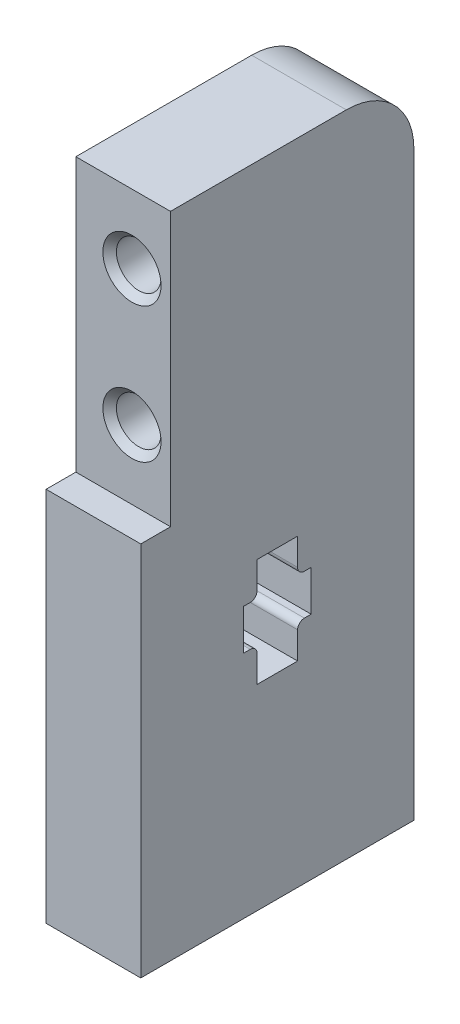
ISO-10303-21;
HEADER;
FILE_DESCRIPTION(('STEP AP214'),'2;1');
FILE_NAME('part.step','',(''),(''),'','','');
FILE_SCHEMA(('AUTOMOTIVE_DESIGN { 1 0 10303 214 1 1 1 1 }'));
ENDSEC;
DATA;
#1=APPLICATION_CONTEXT('core data for automotive mechanical design processes');
#2=APPLICATION_PROTOCOL_DEFINITION('international standard','automotive_design',2000,#1);
#3=PRODUCT_CONTEXT('',#1,'mechanical');
#4=PRODUCT('Part','Part','',(#3));
#5=PRODUCT_RELATED_PRODUCT_CATEGORY('part','',(#4));
#6=PRODUCT_DEFINITION_FORMATION('','',#4);
#7=PRODUCT_DEFINITION_CONTEXT('part definition',#1,'design');
#8=PRODUCT_DEFINITION('design','',#6,#7);
#9=PRODUCT_DEFINITION_SHAPE('','',#8);
#10=(LENGTH_UNIT() NAMED_UNIT(*) SI_UNIT(.MILLI.,.METRE.));
#11=(NAMED_UNIT(*) PLANE_ANGLE_UNIT() SI_UNIT($,.RADIAN.));
#12=(NAMED_UNIT(*) SI_UNIT($,.STERADIAN.) SOLID_ANGLE_UNIT());
#13=UNCERTAINTY_MEASURE_WITH_UNIT(LENGTH_MEASURE(1.E-05),#10,'distance_accuracy_value','');
#14=(GEOMETRIC_REPRESENTATION_CONTEXT(3) GLOBAL_UNCERTAINTY_ASSIGNED_CONTEXT((#13)) GLOBAL_UNIT_ASSIGNED_CONTEXT((#10,
#11,#12)) REPRESENTATION_CONTEXT('',''));
#15=CARTESIAN_POINT('',(0.,0.,0.));
#16=DIRECTION('',(0.,0.,1.));
#17=DIRECTION('',(1.,0.,0.));
#18=AXIS2_PLACEMENT_3D('',#15,#16,#17);
#19=CARTESIAN_POINT('',(0.,17.,-7.6));
#20=DIRECTION('',(0.,-1.,0.));
#21=DIRECTION('',(0.,0.,-1.));
#22=AXIS2_PLACEMENT_3D('',#19,#20,#21);
#23=PLANE('',#22);
#24=DIRECTION('',(0.,0.,-1.));
#25=VECTOR('',#24,1.);
#26=CARTESIAN_POINT('',(0.,17.,-7.6));
#27=LINE('',#26,#25);
#28=CARTESIAN_POINT('',(0.,17.,-12.1));
#29=VERTEX_POINT('',#28);
#30=CARTESIAN_POINT('',(0.,17.,-12.6));
#31=VERTEX_POINT('',#30);
#32=EDGE_CURVE('E256',#29,#31,#27,.T.);
#33=ORIENTED_EDGE('',*,*,#32,.F.);
#34=DIRECTION('',(1.,0.,0.));
#35=VECTOR('',#34,1.);
#36=CARTESIAN_POINT('',(0.,17.,-12.1));
#37=LINE('',#36,#35);
#38=CARTESIAN_POINT('',(7.,17.,-12.1));
#39=VERTEX_POINT('',#38);
#40=EDGE_CURVE('E387',#29,#39,#37,.T.);
#41=ORIENTED_EDGE('',*,*,#40,.T.);
#42=DIRECTION('',(0.,0.,-1.));
#43=VECTOR('',#42,1.);
#44=CARTESIAN_POINT('',(7.,17.,-7.6));
#45=LINE('',#44,#43);
#46=CARTESIAN_POINT('',(7.,17.,-12.6));
#47=VERTEX_POINT('',#46);
#48=EDGE_CURVE('E268',#39,#47,#45,.T.);
#49=ORIENTED_EDGE('',*,*,#48,.T.);
#50=DIRECTION('',(1.,0.,0.));
#51=VECTOR('',#50,1.);
#52=CARTESIAN_POINT('',(0.,17.,-12.6));
#53=LINE('',#52,#51);
#54=EDGE_CURVE('E271',#31,#47,#53,.T.);
#55=ORIENTED_EDGE('',*,*,#54,.F.);
#56=EDGE_LOOP('',(#33,#41,#49,#55));
#57=FACE_BOUND('',#56,.T.);
#58=ADVANCED_FACE('F34',(#57),#23,.F.);
#59=CARTESIAN_POINT('',(0.,20.,-12.6));
#60=DIRECTION('',(0.,1.,0.));
#61=DIRECTION('',(0.,0.,1.));
#62=AXIS2_PLACEMENT_3D('',#59,#60,#61);
#63=PLANE('',#62);
#64=DIRECTION('',(0.,0.,1.));
#65=VECTOR('',#64,1.);
#66=CARTESIAN_POINT('',(0.,20.,-12.6));
#67=LINE('',#66,#65);
#68=CARTESIAN_POINT('',(0.,20.,-8.1));
#69=VERTEX_POINT('',#68);
#70=CARTESIAN_POINT('',(0.,20.,-7.6));
#71=VERTEX_POINT('',#70);
#72=EDGE_CURVE('E248',#69,#71,#67,.T.);
#73=ORIENTED_EDGE('',*,*,#72,.F.);
#74=DIRECTION('',(1.,0.,0.));
#75=VECTOR('',#74,1.);
#76=CARTESIAN_POINT('',(0.,20.,-8.1));
#77=LINE('',#76,#75);
#78=CARTESIAN_POINT('',(7.,20.,-8.1));
#79=VERTEX_POINT('',#78);
#80=EDGE_CURVE('E42',#69,#79,#77,.T.);
#81=ORIENTED_EDGE('',*,*,#80,.T.);
#82=DIRECTION('',(0.,0.,1.));
#83=VECTOR('',#82,1.);
#84=CARTESIAN_POINT('',(7.,20.,-12.6));
#85=LINE('',#84,#83);
#86=CARTESIAN_POINT('',(7.,20.,-7.6));
#87=VERTEX_POINT('',#86);
#88=EDGE_CURVE('E261',#79,#87,#85,.T.);
#89=ORIENTED_EDGE('',*,*,#88,.T.);
#90=DIRECTION('',(1.,0.,0.));
#91=VECTOR('',#90,1.);
#92=CARTESIAN_POINT('',(0.,20.,-7.6));
#93=LINE('',#92,#91);
#94=EDGE_CURVE('E277',#71,#87,#93,.T.);
#95=ORIENTED_EDGE('',*,*,#94,.F.);
#96=EDGE_LOOP('',(#73,#81,#89,#95));
#97=FACE_BOUND('',#96,.T.);
#98=ADVANCED_FACE('F400',(#97),#63,.F.);
#99=CARTESIAN_POINT('',(7.,48.,0.));
#100=DIRECTION('',(0.,-1.,0.));
#101=DIRECTION('',(0.,0.,-1.));
#102=AXIS2_PLACEMENT_3D('',#99,#100,#101);
#103=PLANE('',#102);
#104=DIRECTION('',(0.,0.,1.));
#105=VECTOR('',#104,1.);
#106=CARTESIAN_POINT('',(7.,48.,0.));
#107=LINE('',#106,#105);
#108=CARTESIAN_POINT('',(7.,48.,-15.2));
#109=VERTEX_POINT('',#108);
#110=CARTESIAN_POINT('',(7.,48.,-2.2));
#111=VERTEX_POINT('',#110);
#112=EDGE_CURVE('E321',#109,#111,#107,.T.);
#113=ORIENTED_EDGE('',*,*,#112,.F.);
#114=DIRECTION('',(-1.,0.,0.));
#115=VECTOR('',#114,1.);
#116=CARTESIAN_POINT('',(7.,48.,-15.2));
#117=LINE('',#116,#115);
#118=CARTESIAN_POINT('',(0.,48.,-15.2));
#119=VERTEX_POINT('',#118);
#120=EDGE_CURVE('E360',#109,#119,#117,.T.);
#121=ORIENTED_EDGE('',*,*,#120,.T.);
#122=DIRECTION('',(0.,0.,1.));
#123=VECTOR('',#122,1.);
#124=CARTESIAN_POINT('',(0.,48.,0.));
#125=LINE('',#124,#123);
#126=CARTESIAN_POINT('',(0.,48.,-2.2));
#127=VERTEX_POINT('',#126);
#128=EDGE_CURVE('E316',#119,#127,#125,.T.);
#129=ORIENTED_EDGE('',*,*,#128,.T.);
#130=DIRECTION('',(-1.,0.,0.));
#131=VECTOR('',#130,1.);
#132=CARTESIAN_POINT('',(0.,48.,-2.2));
#133=LINE('',#132,#131);
#134=EDGE_CURVE('E303',#111,#127,#133,.T.);
#135=ORIENTED_EDGE('',*,*,#134,.F.);
#136=EDGE_LOOP('',(#113,#121,#129,#135));
#137=FACE_BOUND('',#136,.T.);
#138=ADVANCED_FACE('F461',(#137),#103,.F.);
#139=CARTESIAN_POINT('',(7.,0.,0.));
#140=DIRECTION('',(0.,0.,-1.));
#141=DIRECTION('',(-1.,0.,0.));
#142=AXIS2_PLACEMENT_3D('',#139,#140,#141);
#143=PLANE('',#142);
#144=DIRECTION('',(0.,-1.,0.));
#145=VECTOR('',#144,1.);
#146=CARTESIAN_POINT('',(7.,0.,0.));
#147=LINE('',#146,#145);
#148=CARTESIAN_POINT('',(7.,27.8,0.));
#149=VERTEX_POINT('',#148);
#150=CARTESIAN_POINT('',(7.,0.,0.));
#151=VERTEX_POINT('',#150);
#152=EDGE_CURVE('E313',#149,#151,#147,.T.);
#153=ORIENTED_EDGE('',*,*,#152,.F.);
#154=DIRECTION('',(1.,0.,0.));
#155=VECTOR('',#154,1.);
#156=CARTESIAN_POINT('',(0.,27.8,0.));
#157=LINE('',#156,#155);
#158=CARTESIAN_POINT('',(0.,27.8,0.));
#159=VERTEX_POINT('',#158);
#160=EDGE_CURVE('E293',#159,#149,#157,.T.);
#161=ORIENTED_EDGE('',*,*,#160,.F.);
#162=DIRECTION('',(0.,-1.,0.));
#163=VECTOR('',#162,1.);
#164=CARTESIAN_POINT('',(0.,0.,0.));
#165=LINE('',#164,#163);
#166=CARTESIAN_POINT('',(0.,0.,0.));
#167=VERTEX_POINT('',#166);
#168=EDGE_CURVE('E311',#159,#167,#165,.T.);
#169=ORIENTED_EDGE('',*,*,#168,.T.);
#170=DIRECTION('',(-1.,0.,0.));
#171=VECTOR('',#170,1.);
#172=CARTESIAN_POINT('',(7.,0.,0.));
#173=LINE('',#172,#171);
#174=EDGE_CURVE('E333',#151,#167,#173,.T.);
#175=ORIENTED_EDGE('',*,*,#174,.F.);
#176=EDGE_LOOP('',(#153,#161,#169,#175));
#177=FACE_BOUND('',#176,.T.);
#178=ADVANCED_FACE('F527',(#177),#143,.F.);
#179=CARTESIAN_POINT('',(7.,0.,0.));
#180=DIRECTION('',(0.,1.,0.));
#181=DIRECTION('',(0.,0.,1.));
#182=AXIS2_PLACEMENT_3D('',#179,#180,#181);
#183=PLANE('',#182);
#184=CARTESIAN_POINT('',(4.15,0.,-15.1));
#185=DIRECTION('',(0.,1.,0.));
#186=DIRECTION('',(0.,0.,1.));
#187=AXIS2_PLACEMENT_3D('',#184,#185,#186);
#188=CIRCLE('',#187,2.14999999999999);
#189=CARTESIAN_POINT('',(4.15,0.,-12.95));
#190=VERTEX_POINT('',#189);
#191=EDGE_CURVE('E342',#190,#190,#188,.T.);
#192=ORIENTED_EDGE('',*,*,#191,.T.);
#193=EDGE_LOOP('',(#192));
#194=FACE_BOUND('',#193,.T.);
#195=CARTESIAN_POINT('',(4.15,0.,-5.1));
#196=DIRECTION('',(0.,1.,0.));
#197=DIRECTION('',(0.,0.,1.));
#198=AXIS2_PLACEMENT_3D('',#195,#196,#197);
#199=CIRCLE('',#198,2.12);
#200=CARTESIAN_POINT('',(4.15,0.,-2.98));
#201=VERTEX_POINT('',#200);
#202=EDGE_CURVE('E339',#201,#201,#199,.T.);
#203=ORIENTED_EDGE('',*,*,#202,.T.);
#204=EDGE_LOOP('',(#203));
#205=FACE_BOUND('',#204,.T.);
#206=DIRECTION('',(0.,0.,-1.));
#207=VECTOR('',#206,1.);
#208=CARTESIAN_POINT('',(0.,0.,0.));
#209=LINE('',#208,#207);
#210=CARTESIAN_POINT('',(0.,0.,-20.2));
#211=VERTEX_POINT('',#210);
#212=EDGE_CURVE('E325',#167,#211,#209,.T.);
#213=ORIENTED_EDGE('',*,*,#212,.T.);
#214=DIRECTION('',(-1.,0.,0.));
#215=VECTOR('',#214,1.);
#216=CARTESIAN_POINT('',(7.,0.,-20.2));
#217=LINE('',#216,#215);
#218=CARTESIAN_POINT('',(7.,0.,-20.2));
#219=VERTEX_POINT('',#218);
#220=EDGE_CURVE('E323',#219,#211,#217,.T.);
#221=ORIENTED_EDGE('',*,*,#220,.F.);
#222=DIRECTION('',(0.,0.,-1.));
#223=VECTOR('',#222,1.);
#224=CARTESIAN_POINT('',(7.,0.,0.));
#225=LINE('',#224,#223);
#226=EDGE_CURVE('E315',#151,#219,#225,.T.);
#227=ORIENTED_EDGE('',*,*,#226,.F.);
#228=ORIENTED_EDGE('',*,*,#174,.T.);
#229=EDGE_LOOP('',(#213,#221,#227,#228));
#230=FACE_BOUND('',#229,.T.);
#231=ADVANCED_FACE('F531',(#194,#205,#230),#183,.F.);
#232=CARTESIAN_POINT('',(7.,0.,-20.2));
#233=DIRECTION('',(0.,0.,1.));
#234=DIRECTION('',(1.,0.,0.));
#235=AXIS2_PLACEMENT_3D('',#232,#233,#234);
#236=PLANE('',#235);
#237=DIRECTION('',(0.,1.,0.));
#238=VECTOR('',#237,1.);
#239=CARTESIAN_POINT('',(0.,0.,-20.2));
#240=LINE('',#239,#238);
#241=CARTESIAN_POINT('',(0.,43.,-20.2));
#242=VERTEX_POINT('',#241);
#243=EDGE_CURVE('E327',#211,#242,#240,.T.);
#244=ORIENTED_EDGE('',*,*,#243,.T.);
#245=DIRECTION('',(-1.,0.,0.));
#246=VECTOR('',#245,1.);
#247=CARTESIAN_POINT('',(7.,43.,-20.2));
#248=LINE('',#247,#246);
#249=CARTESIAN_POINT('',(7.,43.,-20.2));
#250=VERTEX_POINT('',#249);
#251=EDGE_CURVE('E365',#242,#250,#248,.F.);
#252=ORIENTED_EDGE('',*,*,#251,.T.);
#253=DIRECTION('',(0.,1.,0.));
#254=VECTOR('',#253,1.);
#255=CARTESIAN_POINT('',(7.,0.,-20.2));
#256=LINE('',#255,#254);
#257=EDGE_CURVE('E318',#219,#250,#256,.T.);
#258=ORIENTED_EDGE('',*,*,#257,.F.);
#259=ORIENTED_EDGE('',*,*,#220,.T.);
#260=EDGE_LOOP('',(#244,#252,#258,#259));
#261=FACE_BOUND('',#260,.T.);
#262=ADVANCED_FACE('F522',(#261),#236,.F.);
#263=CARTESIAN_POINT('',(7.,0.,0.));
#264=DIRECTION('',(-1.,0.,0.));
#265=DIRECTION('',(0.,0.,1.));
#266=AXIS2_PLACEMENT_3D('',#263,#264,#265);
#267=PLANE('',#266);
#268=DIRECTION('',(0.,-1.,0.));
#269=VECTOR('',#268,1.);
#270=CARTESIAN_POINT('',(7.,14.5,-8.6));
#271=LINE('',#270,#269);
#272=CARTESIAN_POINT('',(7.,16.5,-8.6));
#273=VERTEX_POINT('',#272);
#274=CARTESIAN_POINT('',(7.,14.5,-8.6));
#275=VERTEX_POINT('',#274);
#276=EDGE_CURVE('E207',#273,#275,#271,.T.);
#277=ORIENTED_EDGE('',*,*,#276,.F.);
#278=CARTESIAN_POINT('',(7.,16.5,-8.1));
#279=DIRECTION('',(-1.,0.,0.));
#280=DIRECTION('',(0.,0.,1.));
#281=AXIS2_PLACEMENT_3D('',#278,#279,#280);
#282=CIRCLE('',#281,0.5);
#283=CARTESIAN_POINT('',(7.,17.,-8.1));
#284=VERTEX_POINT('',#283);
#285=EDGE_CURVE('E377',#273,#284,#282,.F.);
#286=ORIENTED_EDGE('',*,*,#285,.T.);
#287=CARTESIAN_POINT('',(7.,17.,-7.6));
#288=VERTEX_POINT('',#287);
#289=EDGE_CURVE('E249',#288,#284,#45,.T.);
#290=ORIENTED_EDGE('',*,*,#289,.F.);
#291=DIRECTION('',(0.,-1.,0.));
#292=VECTOR('',#291,1.);
#293=CARTESIAN_POINT('',(7.,20.,-7.6));
#294=LINE('',#293,#292);
#295=EDGE_CURVE('E265',#87,#288,#294,.T.);
#296=ORIENTED_EDGE('',*,*,#295,.F.);
#297=ORIENTED_EDGE('',*,*,#88,.F.);
#298=CARTESIAN_POINT('',(7.,20.5,-8.1));
#299=DIRECTION('',(-1.,0.,0.));
#300=DIRECTION('',(0.,0.,1.));
#301=AXIS2_PLACEMENT_3D('',#298,#299,#300);
#302=CIRCLE('',#301,0.5);
#303=CARTESIAN_POINT('',(7.,20.5,-8.6));
#304=VERTEX_POINT('',#303);
#305=EDGE_CURVE('E371',#79,#304,#302,.F.);
#306=ORIENTED_EDGE('',*,*,#305,.T.);
#307=DIRECTION('',(0.,-1.,0.));
#308=VECTOR('',#307,1.);
#309=CARTESIAN_POINT('',(7.,22.5,-8.6));
#310=LINE('',#309,#308);
#311=CARTESIAN_POINT('',(7.,22.5,-8.6));
#312=VERTEX_POINT('',#311);
#313=EDGE_CURVE('E224',#312,#304,#310,.T.);
#314=ORIENTED_EDGE('',*,*,#313,.F.);
#315=DIRECTION('',(0.,0.,1.));
#316=VECTOR('',#315,1.);
#317=CARTESIAN_POINT('',(7.,22.5,-8.6));
#318=LINE('',#317,#316);
#319=CARTESIAN_POINT('',(7.,22.5,-11.6));
#320=VERTEX_POINT('',#319);
#321=EDGE_CURVE('E229',#320,#312,#318,.T.);
#322=ORIENTED_EDGE('',*,*,#321,.F.);
#323=DIRECTION('',(0.,1.,0.));
#324=VECTOR('',#323,1.);
#325=CARTESIAN_POINT('',(7.,22.5,-11.6));
#326=LINE('',#325,#324);
#327=CARTESIAN_POINT('',(7.,20.5,-11.6));
#328=VERTEX_POINT('',#327);
#329=EDGE_CURVE('E236',#328,#320,#326,.T.);
#330=ORIENTED_EDGE('',*,*,#329,.F.);
#331=CARTESIAN_POINT('',(7.,20.5,-12.1));
#332=DIRECTION('',(-1.,0.,0.));
#333=DIRECTION('',(0.,0.,1.));
#334=AXIS2_PLACEMENT_3D('',#331,#332,#333);
#335=CIRCLE('',#334,0.5);
#336=CARTESIAN_POINT('',(7.,20.,-12.1));
#337=VERTEX_POINT('',#336);
#338=EDGE_CURVE('E373',#328,#337,#335,.F.);
#339=ORIENTED_EDGE('',*,*,#338,.T.);
#340=CARTESIAN_POINT('',(7.,20.,-12.6));
#341=VERTEX_POINT('',#340);
#342=EDGE_CURVE('E262',#341,#337,#85,.T.);
#343=ORIENTED_EDGE('',*,*,#342,.F.);
#344=DIRECTION('',(0.,1.,0.));
#345=VECTOR('',#344,1.);
#346=CARTESIAN_POINT('',(7.,20.,-12.6));
#347=LINE('',#346,#345);
#348=EDGE_CURVE('E242',#47,#341,#347,.T.);
#349=ORIENTED_EDGE('',*,*,#348,.F.);
#350=ORIENTED_EDGE('',*,*,#48,.F.);
#351=CARTESIAN_POINT('',(7.,16.5,-12.1));
#352=DIRECTION('',(-1.,0.,0.));
#353=DIRECTION('',(0.,0.,1.));
#354=AXIS2_PLACEMENT_3D('',#351,#352,#353);
#355=CIRCLE('',#354,0.5);
#356=CARTESIAN_POINT('',(7.,16.5,-11.6));
#357=VERTEX_POINT('',#356);
#358=EDGE_CURVE('E375',#39,#357,#355,.F.);
#359=ORIENTED_EDGE('',*,*,#358,.T.);
#360=DIRECTION('',(0.,1.,0.));
#361=VECTOR('',#360,1.);
#362=CARTESIAN_POINT('',(7.,14.5,-11.6));
#363=LINE('',#362,#361);
#364=CARTESIAN_POINT('',(7.,14.5,-11.6));
#365=VERTEX_POINT('',#364);
#366=EDGE_CURVE('E218',#365,#357,#363,.T.);
#367=ORIENTED_EDGE('',*,*,#366,.F.);
#368=DIRECTION('',(0.,0.,-1.));
#369=VECTOR('',#368,1.);
#370=CARTESIAN_POINT('',(7.,14.5,-8.6));
#371=LINE('',#370,#369);
#372=EDGE_CURVE('E222',#275,#365,#371,.T.);
#373=ORIENTED_EDGE('',*,*,#372,.F.);
#374=EDGE_LOOP('',(#277,#286,#290,#296,#297,#306,#314,#322,#330,#339,#343,#349,#350,#359,#367,#373));
#375=FACE_BOUND('',#374,.T.);
#376=ORIENTED_EDGE('',*,*,#257,.T.);
#377=CARTESIAN_POINT('',(7.,43.,-15.2));
#378=DIRECTION('',(-1.,0.,0.));
#379=DIRECTION('',(0.,0.,1.));
#380=AXIS2_PLACEMENT_3D('',#377,#378,#379);
#381=CIRCLE('',#380,5.);
#382=EDGE_CURVE('E367',#250,#109,#381,.F.);
#383=ORIENTED_EDGE('',*,*,#382,.T.);
#384=ORIENTED_EDGE('',*,*,#112,.T.);
#385=DIRECTION('',(0.,1.,0.));
#386=VECTOR('',#385,1.);
#387=CARTESIAN_POINT('',(7.,48.,-2.2));
#388=LINE('',#387,#386);
#389=CARTESIAN_POINT('',(7.,27.8,-2.2));
#390=VERTEX_POINT('',#389);
#391=EDGE_CURVE('E300',#390,#111,#388,.T.);
#392=ORIENTED_EDGE('',*,*,#391,.F.);
#393=DIRECTION('',(0.,0.,1.));
#394=VECTOR('',#393,1.);
#395=CARTESIAN_POINT('',(7.,27.8,-2.2));
#396=LINE('',#395,#394);
#397=EDGE_CURVE('E308',#390,#149,#396,.T.);
#398=ORIENTED_EDGE('',*,*,#397,.T.);
#399=ORIENTED_EDGE('',*,*,#152,.T.);
#400=ORIENTED_EDGE('',*,*,#226,.T.);
#401=EDGE_LOOP('',(#376,#383,#384,#392,#398,#399,#400));
#402=FACE_BOUND('',#401,.T.);
#403=ADVANCED_FACE('F405',(#375,#402),#267,.F.);
#404=CARTESIAN_POINT('',(0.,0.,0.));
#405=DIRECTION('',(-1.,0.,0.));
#406=DIRECTION('',(0.,0.,1.));
#407=AXIS2_PLACEMENT_3D('',#404,#405,#406);
#408=PLANE('',#407);
#409=CARTESIAN_POINT('',(0.,17.,-7.6));
#410=VERTEX_POINT('',#409);
#411=CARTESIAN_POINT('',(0.,17.,-8.1));
#412=VERTEX_POINT('',#411);
#413=EDGE_CURVE('E257',#410,#412,#27,.T.);
#414=ORIENTED_EDGE('',*,*,#413,.T.);
#415=CARTESIAN_POINT('',(0.,16.5,-8.1));
#416=DIRECTION('',(-1.,0.,0.));
#417=DIRECTION('',(0.,0.,1.));
#418=AXIS2_PLACEMENT_3D('',#415,#416,#417);
#419=CIRCLE('',#418,0.5);
#420=CARTESIAN_POINT('',(0.,16.5,-8.6));
#421=VERTEX_POINT('',#420);
#422=EDGE_CURVE('E197',#412,#421,#419,.T.);
#423=ORIENTED_EDGE('',*,*,#422,.T.);
#424=DIRECTION('',(0.,-1.,0.));
#425=VECTOR('',#424,1.);
#426=CARTESIAN_POINT('',(0.,14.5,-8.6));
#427=LINE('',#426,#425);
#428=CARTESIAN_POINT('',(0.,14.5,-8.6));
#429=VERTEX_POINT('',#428);
#430=EDGE_CURVE('E188',#421,#429,#427,.T.);
#431=ORIENTED_EDGE('',*,*,#430,.T.);
#432=DIRECTION('',(0.,0.,-1.));
#433=VECTOR('',#432,1.);
#434=CARTESIAN_POINT('',(0.,14.5,-8.6));
#435=LINE('',#434,#433);
#436=CARTESIAN_POINT('',(0.,14.5,-11.6));
#437=VERTEX_POINT('',#436);
#438=EDGE_CURVE('E195',#429,#437,#435,.T.);
#439=ORIENTED_EDGE('',*,*,#438,.T.);
#440=DIRECTION('',(0.,1.,0.));
#441=VECTOR('',#440,1.);
#442=CARTESIAN_POINT('',(0.,14.5,-11.6));
#443=LINE('',#442,#441);
#444=CARTESIAN_POINT('',(0.,16.5,-11.6));
#445=VERTEX_POINT('',#444);
#446=EDGE_CURVE('E201',#437,#445,#443,.T.);
#447=ORIENTED_EDGE('',*,*,#446,.T.);
#448=CARTESIAN_POINT('',(0.,16.5,-12.1));
#449=DIRECTION('',(-1.,0.,0.));
#450=DIRECTION('',(0.,0.,1.));
#451=AXIS2_PLACEMENT_3D('',#448,#449,#450);
#452=CIRCLE('',#451,0.5);
#453=EDGE_CURVE('E384',#445,#29,#452,.T.);
#454=ORIENTED_EDGE('',*,*,#453,.T.);
#455=ORIENTED_EDGE('',*,*,#32,.T.);
#456=DIRECTION('',(0.,1.,0.));
#457=VECTOR('',#456,1.);
#458=CARTESIAN_POINT('',(0.,20.,-12.6));
#459=LINE('',#458,#457);
#460=CARTESIAN_POINT('',(0.,20.,-12.6));
#461=VERTEX_POINT('',#460);
#462=EDGE_CURVE('E245',#31,#461,#459,.T.);
#463=ORIENTED_EDGE('',*,*,#462,.T.);
#464=CARTESIAN_POINT('',(0.,20.,-12.1));
#465=VERTEX_POINT('',#464);
#466=EDGE_CURVE('E250',#461,#465,#67,.T.);
#467=ORIENTED_EDGE('',*,*,#466,.T.);
#468=CARTESIAN_POINT('',(0.,20.5,-12.1));
#469=DIRECTION('',(-1.,0.,0.));
#470=DIRECTION('',(0.,0.,1.));
#471=AXIS2_PLACEMENT_3D('',#468,#469,#470);
#472=CIRCLE('',#471,0.5);
#473=CARTESIAN_POINT('',(0.,20.5,-11.6));
#474=VERTEX_POINT('',#473);
#475=EDGE_CURVE('E382',#465,#474,#472,.T.);
#476=ORIENTED_EDGE('',*,*,#475,.T.);
#477=DIRECTION('',(0.,1.,0.));
#478=VECTOR('',#477,1.);
#479=CARTESIAN_POINT('',(0.,22.5,-11.6));
#480=LINE('',#479,#478);
#481=CARTESIAN_POINT('',(0.,22.5,-11.6));
#482=VERTEX_POINT('',#481);
#483=EDGE_CURVE('E228',#474,#482,#480,.T.);
#484=ORIENTED_EDGE('',*,*,#483,.T.);
#485=DIRECTION('',(0.,0.,1.));
#486=VECTOR('',#485,1.);
#487=CARTESIAN_POINT('',(0.,22.5,-8.6));
#488=LINE('',#487,#486);
#489=CARTESIAN_POINT('',(0.,22.5,-8.6));
#490=VERTEX_POINT('',#489);
#491=EDGE_CURVE('E231',#482,#490,#488,.T.);
#492=ORIENTED_EDGE('',*,*,#491,.T.);
#493=DIRECTION('',(0.,-1.,0.));
#494=VECTOR('',#493,1.);
#495=CARTESIAN_POINT('',(0.,22.5,-8.6));
#496=LINE('',#495,#494);
#497=CARTESIAN_POINT('',(0.,20.5,-8.6));
#498=VERTEX_POINT('',#497);
#499=EDGE_CURVE('E226',#490,#498,#496,.T.);
#500=ORIENTED_EDGE('',*,*,#499,.T.);
#501=CARTESIAN_POINT('',(0.,20.5,-8.1));
#502=DIRECTION('',(-1.,0.,0.));
#503=DIRECTION('',(0.,0.,1.));
#504=AXIS2_PLACEMENT_3D('',#501,#502,#503);
#505=CIRCLE('',#504,0.5);
#506=EDGE_CURVE('E49',#498,#69,#505,.T.);
#507=ORIENTED_EDGE('',*,*,#506,.T.);
#508=ORIENTED_EDGE('',*,*,#72,.T.);
#509=DIRECTION('',(0.,-1.,0.));
#510=VECTOR('',#509,1.);
#511=CARTESIAN_POINT('',(0.,20.,-7.6));
#512=LINE('',#511,#510);
#513=EDGE_CURVE('E253',#71,#410,#512,.T.);
#514=ORIENTED_EDGE('',*,*,#513,.T.);
#515=EDGE_LOOP('',(#414,#423,#431,#439,#447,#454,#455,#463,#467,#476,#484,#492,#500,#507,#508,#514));
#516=FACE_BOUND('',#515,.T.);
#517=ORIENTED_EDGE('',*,*,#128,.F.);
#518=CARTESIAN_POINT('',(0.,43.,-15.2));
#519=DIRECTION('',(-1.,0.,0.));
#520=DIRECTION('',(0.,0.,1.));
#521=AXIS2_PLACEMENT_3D('',#518,#519,#520);
#522=CIRCLE('',#521,5.);
#523=EDGE_CURVE('E363',#119,#242,#522,.T.);
#524=ORIENTED_EDGE('',*,*,#523,.T.);
#525=ORIENTED_EDGE('',*,*,#243,.F.);
#526=ORIENTED_EDGE('',*,*,#212,.F.);
#527=ORIENTED_EDGE('',*,*,#168,.F.);
#528=DIRECTION('',(0.,0.,1.));
#529=VECTOR('',#528,1.);
#530=CARTESIAN_POINT('',(0.,27.8,-2.2));
#531=LINE('',#530,#529);
#532=CARTESIAN_POINT('',(0.,27.8,-2.2));
#533=VERTEX_POINT('',#532);
#534=EDGE_CURVE('E306',#533,#159,#531,.T.);
#535=ORIENTED_EDGE('',*,*,#534,.F.);
#536=DIRECTION('',(0.,-1.,0.));
#537=VECTOR('',#536,1.);
#538=CARTESIAN_POINT('',(0.,48.,-2.2));
#539=LINE('',#538,#537);
#540=EDGE_CURVE('E294',#127,#533,#539,.T.);
#541=ORIENTED_EDGE('',*,*,#540,.F.);
#542=EDGE_LOOP('',(#517,#524,#525,#526,#527,#535,#541));
#543=FACE_BOUND('',#542,.T.);
#544=ADVANCED_FACE('F191',(#516,#543),#408,.T.);
#545=CARTESIAN_POINT('',(0.,27.8,-2.2));
#546=DIRECTION('',(0.,-1.,0.));
#547=DIRECTION('',(0.,0.,-1.));
#548=AXIS2_PLACEMENT_3D('',#545,#546,#547);
#549=PLANE('',#548);
#550=ORIENTED_EDGE('',*,*,#160,.T.);
#551=ORIENTED_EDGE('',*,*,#397,.F.);
#552=DIRECTION('',(1.,0.,0.));
#553=VECTOR('',#552,1.);
#554=CARTESIAN_POINT('',(0.,27.8,-2.2));
#555=LINE('',#554,#553);
#556=EDGE_CURVE('E297',#533,#390,#555,.T.);
#557=ORIENTED_EDGE('',*,*,#556,.F.);
#558=ORIENTED_EDGE('',*,*,#534,.T.);
#559=EDGE_LOOP('',(#550,#551,#557,#558));
#560=FACE_BOUND('',#559,.T.);
#561=ADVANCED_FACE('F515',(#560),#549,.F.);
#562=CARTESIAN_POINT('',(0.,0.,-2.2));
#563=DIRECTION('',(0.,0.,1.));
#564=DIRECTION('',(1.,0.,0.));
#565=AXIS2_PLACEMENT_3D('',#562,#563,#564);
#566=PLANE('',#565);
#567=CARTESIAN_POINT('',(4.15,32.9,-2.2));
#568=DIRECTION('',(0.,0.,1.));
#569=DIRECTION('',(1.,0.,0.));
#570=AXIS2_PLACEMENT_3D('',#567,#568,#569);
#571=CIRCLE('',#570,2.15);
#572=CARTESIAN_POINT('',(6.3,32.9,-2.2));
#573=VERTEX_POINT('',#572);
#574=EDGE_CURVE('E354',#573,#573,#571,.F.);
#575=ORIENTED_EDGE('',*,*,#574,.T.);
#576=EDGE_LOOP('',(#575));
#577=FACE_BOUND('',#576,.T.);
#578=CARTESIAN_POINT('',(4.15,42.9,-2.2));
#579=DIRECTION('',(0.,0.,1.));
#580=DIRECTION('',(1.,0.,0.));
#581=AXIS2_PLACEMENT_3D('',#578,#579,#580);
#582=CIRCLE('',#581,2.15);
#583=CARTESIAN_POINT('',(6.3,42.9,-2.2));
#584=VERTEX_POINT('',#583);
#585=EDGE_CURVE('E351',#584,#584,#582,.F.);
#586=ORIENTED_EDGE('',*,*,#585,.T.);
#587=EDGE_LOOP('',(#586));
#588=FACE_BOUND('',#587,.T.);
#589=ORIENTED_EDGE('',*,*,#540,.T.);
#590=ORIENTED_EDGE('',*,*,#556,.T.);
#591=ORIENTED_EDGE('',*,*,#391,.T.);
#592=ORIENTED_EDGE('',*,*,#134,.T.);
#593=EDGE_LOOP('',(#589,#590,#591,#592));
#594=FACE_BOUND('',#593,.T.);
#595=ADVANCED_FACE('F511',(#577,#588,#594),#566,.T.);
#596=CARTESIAN_POINT('',(4.15,15.,-5.1));
#597=DIRECTION('',(0.,-1.,0.));
#598=DIRECTION('',(0.,0.,-1.));
#599=AXIS2_PLACEMENT_3D('',#596,#597,#598);
#600=CYLINDRICAL_SURFACE('',#599,1.62);
#601=CARTESIAN_POINT('',(4.15,0.500000000000009,-5.1));
#602=DIRECTION('',(0.,1.,0.));
#603=DIRECTION('',(0.,0.,1.));
#604=AXIS2_PLACEMENT_3D('',#601,#602,#603);
#605=CIRCLE('',#604,1.62);
#606=CARTESIAN_POINT('',(4.15,0.500000000000009,-3.48));
#607=VERTEX_POINT('',#606);
#608=EDGE_CURVE('E345',#607,#607,#605,.F.);
#609=ORIENTED_EDGE('',*,*,#608,.T.);
#610=EDGE_LOOP('',(#609));
#611=FACE_BOUND('',#610,.T.);
#612=CARTESIAN_POINT('',(4.15,15.,-5.1));
#613=DIRECTION('',(0.,-1.,0.));
#614=DIRECTION('',(0.,0.,-1.));
#615=AXIS2_PLACEMENT_3D('',#612,#613,#614);
#616=CIRCLE('',#615,1.62);
#617=CARTESIAN_POINT('',(4.15,15.,-6.72));
#618=VERTEX_POINT('',#617);
#619=EDGE_CURVE('E290',#618,#618,#616,.T.);
#620=ORIENTED_EDGE('',*,*,#619,.F.);
#621=EDGE_LOOP('',(#620));
#622=FACE_BOUND('',#621,.T.);
#623=ADVANCED_FACE('F507',(#611,#622),#600,.F.);
#624=CARTESIAN_POINT('',(0.,15.,0.));
#625=DIRECTION('',(0.,-1.,0.));
#626=DIRECTION('',(0.,0.,-1.));
#627=AXIS2_PLACEMENT_3D('',#624,#625,#626);
#628=PLANE('',#627);
#629=ORIENTED_EDGE('',*,*,#619,.T.);
#630=EDGE_LOOP('',(#629));
#631=FACE_BOUND('',#630,.T.);
#632=ADVANCED_FACE('F503',(#631),#628,.T.);
#633=CARTESIAN_POINT('',(4.15,15.,-15.1));
#634=DIRECTION('',(0.,-1.,0.));
#635=DIRECTION('',(0.,0.,-1.));
#636=AXIS2_PLACEMENT_3D('',#633,#634,#635);
#637=CYLINDRICAL_SURFACE('',#636,1.65);
#638=CARTESIAN_POINT('',(4.15,0.49999999999999,-15.1));
#639=DIRECTION('',(0.,1.,0.));
#640=DIRECTION('',(0.,0.,1.));
#641=AXIS2_PLACEMENT_3D('',#638,#639,#640);
#642=CIRCLE('',#641,1.65);
#643=CARTESIAN_POINT('',(4.15,0.49999999999999,-13.45));
#644=VERTEX_POINT('',#643);
#645=EDGE_CURVE('E336',#644,#644,#642,.F.);
#646=ORIENTED_EDGE('',*,*,#645,.T.);
#647=EDGE_LOOP('',(#646));
#648=FACE_BOUND('',#647,.T.);
#649=CARTESIAN_POINT('',(4.15,15.,-15.1));
#650=DIRECTION('',(0.,-1.,0.));
#651=DIRECTION('',(0.,0.,-1.));
#652=AXIS2_PLACEMENT_3D('',#649,#650,#651);
#653=CIRCLE('',#652,1.65);
#654=CARTESIAN_POINT('',(4.15,15.,-16.75));
#655=VERTEX_POINT('',#654);
#656=EDGE_CURVE('E287',#655,#655,#653,.T.);
#657=ORIENTED_EDGE('',*,*,#656,.F.);
#658=EDGE_LOOP('',(#657));
#659=FACE_BOUND('',#658,.T.);
#660=ADVANCED_FACE('F499',(#648,#659),#637,.F.);
#661=CARTESIAN_POINT('',(0.,15.,0.));
#662=DIRECTION('',(0.,-1.,0.));
#663=DIRECTION('',(0.,0.,-1.));
#664=AXIS2_PLACEMENT_3D('',#661,#662,#663);
#665=PLANE('',#664);
#666=ORIENTED_EDGE('',*,*,#656,.T.);
#667=EDGE_LOOP('',(#666));
#668=FACE_BOUND('',#667,.T.);
#669=ADVANCED_FACE('F495',(#668),#665,.T.);
#670=CARTESIAN_POINT('',(4.15,42.9,-17.2));
#671=DIRECTION('',(0.,0.,1.));
#672=DIRECTION('',(1.,0.,0.));
#673=AXIS2_PLACEMENT_3D('',#670,#671,#672);
#674=CYLINDRICAL_SURFACE('',#673,1.65);
#675=CARTESIAN_POINT('',(4.15,42.9,-2.7));
#676=DIRECTION('',(0.,0.,1.));
#677=DIRECTION('',(1.,0.,0.));
#678=AXIS2_PLACEMENT_3D('',#675,#676,#677);
#679=CIRCLE('',#678,1.65);
#680=CARTESIAN_POINT('',(5.8,42.9,-2.7));
#681=VERTEX_POINT('',#680);
#682=EDGE_CURVE('E357',#681,#681,#679,.T.);
#683=ORIENTED_EDGE('',*,*,#682,.T.);
#684=EDGE_LOOP('',(#683));
#685=FACE_BOUND('',#684,.T.);
#686=CARTESIAN_POINT('',(4.15,42.9,-17.2));
#687=DIRECTION('',(0.,0.,1.));
#688=DIRECTION('',(1.,0.,0.));
#689=AXIS2_PLACEMENT_3D('',#686,#687,#688);
#690=CIRCLE('',#689,1.65);
#691=CARTESIAN_POINT('',(5.8,42.9,-17.2));
#692=VERTEX_POINT('',#691);
#693=EDGE_CURVE('E284',#692,#692,#690,.T.);
#694=ORIENTED_EDGE('',*,*,#693,.F.);
#695=EDGE_LOOP('',(#694));
#696=FACE_BOUND('',#695,.T.);
#697=ADVANCED_FACE('F491',(#685,#696),#674,.F.);
#698=CARTESIAN_POINT('',(0.,0.,-17.2));
#699=DIRECTION('',(0.,0.,1.));
#700=DIRECTION('',(1.,0.,0.));
#701=AXIS2_PLACEMENT_3D('',#698,#699,#700);
#702=PLANE('',#701);
#703=ORIENTED_EDGE('',*,*,#693,.T.);
#704=EDGE_LOOP('',(#703));
#705=FACE_BOUND('',#704,.T.);
#706=ADVANCED_FACE('F487',(#705),#702,.T.);
#707=CARTESIAN_POINT('',(4.15,32.9,-17.2));
#708=DIRECTION('',(0.,0.,1.));
#709=DIRECTION('',(1.,0.,0.));
#710=AXIS2_PLACEMENT_3D('',#707,#708,#709);
#711=CYLINDRICAL_SURFACE('',#710,1.65);
#712=CARTESIAN_POINT('',(4.15,32.9,-2.7));
#713=DIRECTION('',(0.,0.,1.));
#714=DIRECTION('',(1.,0.,0.));
#715=AXIS2_PLACEMENT_3D('',#712,#713,#714);
#716=CIRCLE('',#715,1.65);
#717=CARTESIAN_POINT('',(5.8,32.9,-2.7));
#718=VERTEX_POINT('',#717);
#719=EDGE_CURVE('E348',#718,#718,#716,.T.);
#720=ORIENTED_EDGE('',*,*,#719,.T.);
#721=EDGE_LOOP('',(#720));
#722=FACE_BOUND('',#721,.T.);
#723=CARTESIAN_POINT('',(4.15,32.9,-17.2));
#724=DIRECTION('',(0.,0.,1.));
#725=DIRECTION('',(1.,0.,0.));
#726=AXIS2_PLACEMENT_3D('',#723,#724,#725);
#727=CIRCLE('',#726,1.65);
#728=CARTESIAN_POINT('',(5.8,32.9,-17.2));
#729=VERTEX_POINT('',#728);
#730=EDGE_CURVE('E274',#729,#729,#727,.T.);
#731=ORIENTED_EDGE('',*,*,#730,.F.);
#732=EDGE_LOOP('',(#731));
#733=FACE_BOUND('',#732,.T.);
#734=ADVANCED_FACE('F483',(#722,#733),#711,.F.);
#735=CARTESIAN_POINT('',(0.,0.,-17.2));
#736=DIRECTION('',(0.,0.,1.));
#737=DIRECTION('',(1.,0.,0.));
#738=AXIS2_PLACEMENT_3D('',#735,#736,#737);
#739=PLANE('',#738);
#740=ORIENTED_EDGE('',*,*,#730,.T.);
#741=EDGE_LOOP('',(#740));
#742=FACE_BOUND('',#741,.T.);
#743=ADVANCED_FACE('F479',(#742),#739,.T.);
#744=CARTESIAN_POINT('',(4.15,0.49999999999999,-15.1));
#745=DIRECTION('',(0.,-1.,0.));
#746=DIRECTION('',(0.,0.,-1.));
#747=AXIS2_PLACEMENT_3D('',#744,#745,#746);
#748=CONICAL_SURFACE('',#747,1.65,0.785398163397443);
#749=ORIENTED_EDGE('',*,*,#191,.F.);
#750=EDGE_LOOP('',(#749));
#751=FACE_BOUND('',#750,.T.);
#752=ORIENTED_EDGE('',*,*,#645,.F.);
#753=EDGE_LOOP('',(#752));
#754=FACE_BOUND('',#753,.T.);
#755=ADVANCED_FACE('F482',(#751,#754),#748,.F.);
#756=CARTESIAN_POINT('',(4.15,0.500000000000009,-5.1));
#757=DIRECTION('',(0.,-1.,0.));
#758=DIRECTION('',(0.,0.,-1.));
#759=AXIS2_PLACEMENT_3D('',#756,#757,#758);
#760=CONICAL_SURFACE('',#759,1.62,0.785398163397443);
#761=ORIENTED_EDGE('',*,*,#202,.F.);
#762=EDGE_LOOP('',(#761));
#763=FACE_BOUND('',#762,.T.);
#764=ORIENTED_EDGE('',*,*,#608,.F.);
#765=EDGE_LOOP('',(#764));
#766=FACE_BOUND('',#765,.T.);
#767=ADVANCED_FACE('F541',(#763,#766),#760,.F.);
#768=CARTESIAN_POINT('',(4.15,32.9,-2.7));
#769=DIRECTION('',(0.,0.,1.));
#770=DIRECTION('',(1.,0.,0.));
#771=AXIS2_PLACEMENT_3D('',#768,#769,#770);
#772=CONICAL_SURFACE('',#771,1.65,0.785398163397443);
#773=ORIENTED_EDGE('',*,*,#574,.F.);
#774=EDGE_LOOP('',(#773));
#775=FACE_BOUND('',#774,.T.);
#776=ORIENTED_EDGE('',*,*,#719,.F.);
#777=EDGE_LOOP('',(#776));
#778=FACE_BOUND('',#777,.T.);
#779=ADVANCED_FACE('F545',(#775,#778),#772,.F.);
#780=CARTESIAN_POINT('',(4.15,42.9,-2.7));
#781=DIRECTION('',(0.,0.,1.));
#782=DIRECTION('',(1.,0.,0.));
#783=AXIS2_PLACEMENT_3D('',#780,#781,#782);
#784=CONICAL_SURFACE('',#783,1.65,0.785398163397443);
#785=ORIENTED_EDGE('',*,*,#585,.F.);
#786=EDGE_LOOP('',(#785));
#787=FACE_BOUND('',#786,.T.);
#788=ORIENTED_EDGE('',*,*,#682,.F.);
#789=EDGE_LOOP('',(#788));
#790=FACE_BOUND('',#789,.T.);
#791=ADVANCED_FACE('F475',(#787,#790),#784,.F.);
#792=CARTESIAN_POINT('',(7.,43.,-15.2));
#793=DIRECTION('',(-1.,0.,0.));
#794=DIRECTION('',(0.,0.,1.));
#795=AXIS2_PLACEMENT_3D('',#792,#793,#794);
#796=CYLINDRICAL_SURFACE('',#795,5.);
#797=ORIENTED_EDGE('',*,*,#382,.F.);
#798=ORIENTED_EDGE('',*,*,#251,.F.);
#799=ORIENTED_EDGE('',*,*,#523,.F.);
#800=ORIENTED_EDGE('',*,*,#120,.F.);
#801=EDGE_LOOP('',(#797,#798,#799,#800));
#802=FACE_BOUND('',#801,.T.);
#803=ADVANCED_FACE('F471',(#802),#796,.T.);
#804=CARTESIAN_POINT('',(0.,20.,-12.6));
#805=DIRECTION('',(0.,0.,-1.));
#806=DIRECTION('',(-1.,0.,0.));
#807=AXIS2_PLACEMENT_3D('',#804,#805,#806);
#808=PLANE('',#807);
#809=ORIENTED_EDGE('',*,*,#348,.T.);
#810=DIRECTION('',(1.,0.,0.));
#811=VECTOR('',#810,1.);
#812=CARTESIAN_POINT('',(0.,20.,-12.6));
#813=LINE('',#812,#811);
#814=EDGE_CURVE('E259',#461,#341,#813,.T.);
#815=ORIENTED_EDGE('',*,*,#814,.F.);
#816=ORIENTED_EDGE('',*,*,#462,.F.);
#817=ORIENTED_EDGE('',*,*,#54,.T.);
#818=EDGE_LOOP('',(#809,#815,#816,#817));
#819=FACE_BOUND('',#818,.T.);
#820=ADVANCED_FACE('F432',(#819),#808,.F.);
#821=ORIENTED_EDGE('',*,*,#289,.T.);
#822=DIRECTION('',(1.,0.,0.));
#823=VECTOR('',#822,1.);
#824=CARTESIAN_POINT('',(0.,17.,-8.1));
#825=LINE('',#824,#823);
#826=EDGE_CURVE('E379',#284,#412,#825,.F.);
#827=ORIENTED_EDGE('',*,*,#826,.T.);
#828=ORIENTED_EDGE('',*,*,#413,.F.);
#829=DIRECTION('',(1.,0.,0.));
#830=VECTOR('',#829,1.);
#831=CARTESIAN_POINT('',(0.,17.,-7.6));
#832=LINE('',#831,#830);
#833=EDGE_CURVE('E275',#410,#288,#832,.T.);
#834=ORIENTED_EDGE('',*,*,#833,.T.);
#835=EDGE_LOOP('',(#821,#827,#828,#834));
#836=FACE_BOUND('',#835,.T.);
#837=ADVANCED_FACE('F456',(#836),#23,.F.);
#838=CARTESIAN_POINT('',(0.,20.,-7.6));
#839=DIRECTION('',(0.,0.,1.));
#840=DIRECTION('',(1.,0.,0.));
#841=AXIS2_PLACEMENT_3D('',#838,#839,#840);
#842=PLANE('',#841);
#843=ORIENTED_EDGE('',*,*,#295,.T.);
#844=ORIENTED_EDGE('',*,*,#833,.F.);
#845=ORIENTED_EDGE('',*,*,#513,.F.);
#846=ORIENTED_EDGE('',*,*,#94,.T.);
#847=EDGE_LOOP('',(#843,#844,#845,#846));
#848=FACE_BOUND('',#847,.T.);
#849=ADVANCED_FACE('F410',(#848),#842,.F.);
#850=ORIENTED_EDGE('',*,*,#342,.T.);
#851=DIRECTION('',(1.,0.,0.));
#852=VECTOR('',#851,1.);
#853=CARTESIAN_POINT('',(0.,20.,-12.1));
#854=LINE('',#853,#852);
#855=EDGE_CURVE('E395',#337,#465,#854,.F.);
#856=ORIENTED_EDGE('',*,*,#855,.T.);
#857=ORIENTED_EDGE('',*,*,#466,.F.);
#858=ORIENTED_EDGE('',*,*,#814,.T.);
#859=EDGE_LOOP('',(#850,#856,#857,#858));
#860=FACE_BOUND('',#859,.T.);
#861=ADVANCED_FACE('F463',(#860),#63,.F.);
#862=CARTESIAN_POINT('',(0.,22.5,-8.6));
#863=DIRECTION('',(0.,0.,1.));
#864=DIRECTION('',(1.,0.,0.));
#865=AXIS2_PLACEMENT_3D('',#862,#863,#864);
#866=PLANE('',#865);
#867=ORIENTED_EDGE('',*,*,#313,.T.);
#868=DIRECTION('',(1.,0.,0.));
#869=VECTOR('',#868,1.);
#870=CARTESIAN_POINT('',(0.,20.5,-8.6));
#871=LINE('',#870,#869);
#872=EDGE_CURVE('E11',#304,#498,#871,.F.);
#873=ORIENTED_EDGE('',*,*,#872,.T.);
#874=ORIENTED_EDGE('',*,*,#499,.F.);
#875=DIRECTION('',(1.,0.,0.));
#876=VECTOR('',#875,1.);
#877=CARTESIAN_POINT('',(0.,22.5,-8.6));
#878=LINE('',#877,#876);
#879=EDGE_CURVE('E240',#490,#312,#878,.T.);
#880=ORIENTED_EDGE('',*,*,#879,.T.);
#881=EDGE_LOOP('',(#867,#873,#874,#880));
#882=FACE_BOUND('',#881,.T.);
#883=ADVANCED_FACE('F613',(#882),#866,.F.);
#884=CARTESIAN_POINT('',(0.,22.5,-8.6));
#885=DIRECTION('',(0.,1.,0.));
#886=DIRECTION('',(0.,0.,1.));
#887=AXIS2_PLACEMENT_3D('',#884,#885,#886);
#888=PLANE('',#887);
#889=ORIENTED_EDGE('',*,*,#321,.T.);
#890=ORIENTED_EDGE('',*,*,#879,.F.);
#891=ORIENTED_EDGE('',*,*,#491,.F.);
#892=DIRECTION('',(1.,0.,0.));
#893=VECTOR('',#892,1.);
#894=CARTESIAN_POINT('',(0.,22.5,-11.6));
#895=LINE('',#894,#893);
#896=EDGE_CURVE('E234',#482,#320,#895,.T.);
#897=ORIENTED_EDGE('',*,*,#896,.T.);
#898=EDGE_LOOP('',(#889,#890,#891,#897));
#899=FACE_BOUND('',#898,.T.);
#900=ADVANCED_FACE('F448',(#899),#888,.F.);
#901=CARTESIAN_POINT('',(0.,22.5,-11.6));
#902=DIRECTION('',(0.,0.,-1.));
#903=DIRECTION('',(-1.,0.,0.));
#904=AXIS2_PLACEMENT_3D('',#901,#902,#903);
#905=PLANE('',#904);
#906=ORIENTED_EDGE('',*,*,#483,.F.);
#907=DIRECTION('',(1.,0.,0.));
#908=VECTOR('',#907,1.);
#909=CARTESIAN_POINT('',(0.,20.5,-11.6));
#910=LINE('',#909,#908);
#911=EDGE_CURVE('E392',#474,#328,#910,.T.);
#912=ORIENTED_EDGE('',*,*,#911,.T.);
#913=ORIENTED_EDGE('',*,*,#329,.T.);
#914=ORIENTED_EDGE('',*,*,#896,.F.);
#915=EDGE_LOOP('',(#906,#912,#913,#914));
#916=FACE_BOUND('',#915,.T.);
#917=ADVANCED_FACE('F443',(#916),#905,.F.);
#918=CARTESIAN_POINT('',(0.,14.5,-11.6));
#919=DIRECTION('',(0.,0.,-1.));
#920=DIRECTION('',(-1.,0.,0.));
#921=AXIS2_PLACEMENT_3D('',#918,#919,#920);
#922=PLANE('',#921);
#923=ORIENTED_EDGE('',*,*,#366,.T.);
#924=DIRECTION('',(1.,0.,0.));
#925=VECTOR('',#924,1.);
#926=CARTESIAN_POINT('',(0.,16.5,-11.6));
#927=LINE('',#926,#925);
#928=EDGE_CURVE('E390',#357,#445,#927,.F.);
#929=ORIENTED_EDGE('',*,*,#928,.T.);
#930=ORIENTED_EDGE('',*,*,#446,.F.);
#931=DIRECTION('',(1.,0.,0.));
#932=VECTOR('',#931,1.);
#933=CARTESIAN_POINT('',(0.,14.5,-11.6));
#934=LINE('',#933,#932);
#935=EDGE_CURVE('E211',#437,#365,#934,.T.);
#936=ORIENTED_EDGE('',*,*,#935,.T.);
#937=EDGE_LOOP('',(#923,#929,#930,#936));
#938=FACE_BOUND('',#937,.T.);
#939=ADVANCED_FACE('F421',(#938),#922,.F.);
#940=CARTESIAN_POINT('',(0.,14.5,-8.6));
#941=DIRECTION('',(0.,-1.,0.));
#942=DIRECTION('',(0.,0.,-1.));
#943=AXIS2_PLACEMENT_3D('',#940,#941,#942);
#944=PLANE('',#943);
#945=ORIENTED_EDGE('',*,*,#372,.T.);
#946=ORIENTED_EDGE('',*,*,#935,.F.);
#947=ORIENTED_EDGE('',*,*,#438,.F.);
#948=DIRECTION('',(1.,0.,0.));
#949=VECTOR('',#948,1.);
#950=CARTESIAN_POINT('',(0.,14.5,-8.6));
#951=LINE('',#950,#949);
#952=EDGE_CURVE('E204',#429,#275,#951,.T.);
#953=ORIENTED_EDGE('',*,*,#952,.T.);
#954=EDGE_LOOP('',(#945,#946,#947,#953));
#955=FACE_BOUND('',#954,.T.);
#956=ADVANCED_FACE('F213',(#955),#944,.F.);
#957=CARTESIAN_POINT('',(0.,14.5,-8.6));
#958=DIRECTION('',(0.,0.,1.));
#959=DIRECTION('',(1.,0.,0.));
#960=AXIS2_PLACEMENT_3D('',#957,#958,#959);
#961=PLANE('',#960);
#962=ORIENTED_EDGE('',*,*,#430,.F.);
#963=DIRECTION('',(1.,0.,0.));
#964=VECTOR('',#963,1.);
#965=CARTESIAN_POINT('',(0.,16.5,-8.6));
#966=LINE('',#965,#964);
#967=EDGE_CURVE('E369',#421,#273,#966,.T.);
#968=ORIENTED_EDGE('',*,*,#967,.T.);
#969=ORIENTED_EDGE('',*,*,#276,.T.);
#970=ORIENTED_EDGE('',*,*,#952,.F.);
#971=EDGE_LOOP('',(#962,#968,#969,#970));
#972=FACE_BOUND('',#971,.T.);
#973=ADVANCED_FACE('F205',(#972),#961,.F.);
#974=CARTESIAN_POINT('',(0.,16.5,-8.1));
#975=DIRECTION('',(1.,0.,0.));
#976=DIRECTION('',(0.,0.,-1.));
#977=AXIS2_PLACEMENT_3D('',#974,#975,#976);
#978=CYLINDRICAL_SURFACE('',#977,0.5);
#979=ORIENTED_EDGE('',*,*,#422,.F.);
#980=ORIENTED_EDGE('',*,*,#826,.F.);
#981=ORIENTED_EDGE('',*,*,#285,.F.);
#982=ORIENTED_EDGE('',*,*,#967,.F.);
#983=EDGE_LOOP('',(#979,#980,#981,#982));
#984=FACE_BOUND('',#983,.T.);
#985=ADVANCED_FACE('F416',(#984),#978,.T.);
#986=CARTESIAN_POINT('',(0.,16.5,-12.1));
#987=DIRECTION('',(1.,0.,0.));
#988=DIRECTION('',(0.,0.,-1.));
#989=AXIS2_PLACEMENT_3D('',#986,#987,#988);
#990=CYLINDRICAL_SURFACE('',#989,0.5);
#991=ORIENTED_EDGE('',*,*,#453,.F.);
#992=ORIENTED_EDGE('',*,*,#928,.F.);
#993=ORIENTED_EDGE('',*,*,#358,.F.);
#994=ORIENTED_EDGE('',*,*,#40,.F.);
#995=EDGE_LOOP('',(#991,#992,#993,#994));
#996=FACE_BOUND('',#995,.T.);
#997=ADVANCED_FACE('F424',(#996),#990,.T.);
#998=CARTESIAN_POINT('',(0.,20.5,-12.1));
#999=DIRECTION('',(1.,0.,0.));
#1000=DIRECTION('',(0.,0.,-1.));
#1001=AXIS2_PLACEMENT_3D('',#998,#999,#1000);
#1002=CYLINDRICAL_SURFACE('',#1001,0.5);
#1003=ORIENTED_EDGE('',*,*,#475,.F.);
#1004=ORIENTED_EDGE('',*,*,#855,.F.);
#1005=ORIENTED_EDGE('',*,*,#338,.F.);
#1006=ORIENTED_EDGE('',*,*,#911,.F.);
#1007=EDGE_LOOP('',(#1003,#1004,#1005,#1006));
#1008=FACE_BOUND('',#1007,.T.);
#1009=ADVANCED_FACE('F440',(#1008),#1002,.T.);
#1010=CARTESIAN_POINT('',(0.,20.5,-8.1));
#1011=DIRECTION('',(1.,0.,0.));
#1012=DIRECTION('',(0.,0.,-1.));
#1013=AXIS2_PLACEMENT_3D('',#1010,#1011,#1012);
#1014=CYLINDRICAL_SURFACE('',#1013,0.5);
#1015=ORIENTED_EDGE('',*,*,#506,.F.);
#1016=ORIENTED_EDGE('',*,*,#872,.F.);
#1017=ORIENTED_EDGE('',*,*,#305,.F.);
#1018=ORIENTED_EDGE('',*,*,#80,.F.);
#1019=EDGE_LOOP('',(#1015,#1016,#1017,#1018));
#1020=FACE_BOUND('',#1019,.T.);
#1021=ADVANCED_FACE('F36',(#1020),#1014,.T.);
#1022=CLOSED_SHELL('',(#58,#98,#138,#178,#231,#262,#403,#544,#561,#595,#623,#632,#660,#669,#697,
#706,#734,#743,#755,#767,#779,#791,#803,#820,#837,#849,#861,#883,#900,#917,#939,#956,#973,#985,
#997,#1009,#1021));
#1023=MANIFOLD_SOLID_BREP('B2',#1022);
#1024=ADVANCED_BREP_SHAPE_REPRESENTATION('',(#18,#1023),#14);
#1025=SHAPE_DEFINITION_REPRESENTATION(#9,#1024);
ENDSEC;
END-ISO-10303-21;
